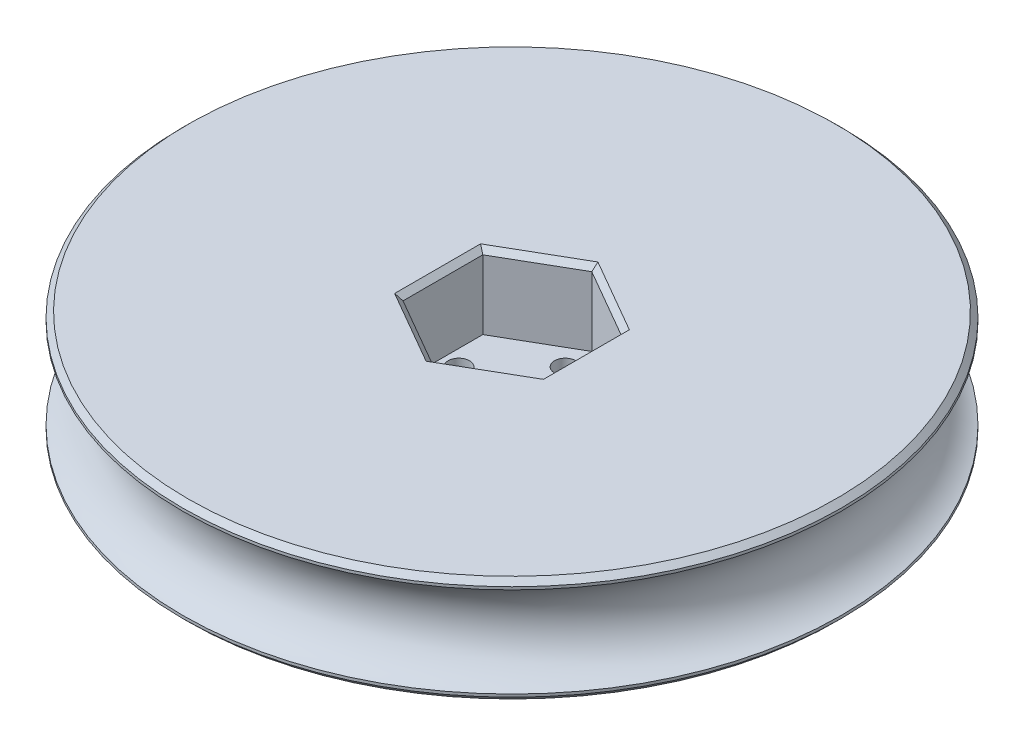
ISO-10303-21;
HEADER;
FILE_DESCRIPTION(('STEP AP214'),'2;1');
FILE_NAME('part.step','',(''),(''),'','','');
FILE_SCHEMA(('AUTOMOTIVE_DESIGN { 1 0 10303 214 1 1 1 1 }'));
ENDSEC;
DATA;
#1=APPLICATION_CONTEXT('core data for automotive mechanical design processes');
#2=APPLICATION_PROTOCOL_DEFINITION('international standard','automotive_design',2000,#1);
#3=PRODUCT_CONTEXT('',#1,'mechanical');
#4=PRODUCT('Part','Part','',(#3));
#5=PRODUCT_RELATED_PRODUCT_CATEGORY('part','',(#4));
#6=PRODUCT_DEFINITION_FORMATION('','',#4);
#7=PRODUCT_DEFINITION_CONTEXT('part definition',#1,'design');
#8=PRODUCT_DEFINITION('design','',#6,#7);
#9=PRODUCT_DEFINITION_SHAPE('','',#8);
#10=(LENGTH_UNIT() NAMED_UNIT(*) SI_UNIT(.MILLI.,.METRE.));
#11=(NAMED_UNIT(*) PLANE_ANGLE_UNIT() SI_UNIT($,.RADIAN.));
#12=(NAMED_UNIT(*) SI_UNIT($,.STERADIAN.) SOLID_ANGLE_UNIT());
#13=UNCERTAINTY_MEASURE_WITH_UNIT(LENGTH_MEASURE(1.E-05),#10,'distance_accuracy_value','');
#14=(GEOMETRIC_REPRESENTATION_CONTEXT(3) GLOBAL_UNCERTAINTY_ASSIGNED_CONTEXT((#13)) GLOBAL_UNIT_ASSIGNED_CONTEXT((#10,
#11,#12)) REPRESENTATION_CONTEXT('',''));
#15=CARTESIAN_POINT('',(0.,0.,0.));
#16=DIRECTION('',(0.,0.,1.));
#17=DIRECTION('',(1.,0.,0.));
#18=AXIS2_PLACEMENT_3D('',#15,#16,#17);
#19=CARTESIAN_POINT('',(0.,20.,0.));
#20=DIRECTION('',(0.,-1.,0.));
#21=DIRECTION('',(0.,0.,-1.));
#22=AXIS2_PLACEMENT_3D('',#19,#20,#21);
#23=CYLINDRICAL_SURFACE('',#22,62.);
#24=CARTESIAN_POINT('',(0.,1.00000000000001,0.));
#25=DIRECTION('',(0.,1.,0.));
#26=DIRECTION('',(0.,0.,1.));
#27=AXIS2_PLACEMENT_3D('',#24,#25,#26);
#28=CIRCLE('',#27,62.);
#29=CARTESIAN_POINT('',(0.,1.00000000000001,62.));
#30=VERTEX_POINT('',#29);
#31=EDGE_CURVE('E185',#30,#30,#28,.T.);
#32=ORIENTED_EDGE('',*,*,#31,.T.);
#33=EDGE_LOOP('',(#32));
#34=FACE_BOUND('',#33,.T.);
#35=CARTESIAN_POINT('',(0.,1.51471862576144,0.));
#36=DIRECTION('',(0.,1.,0.));
#37=DIRECTION('',(-1.,0.,0.));
#38=AXIS2_PLACEMENT_3D('',#35,#36,#37);
#39=CIRCLE('',#38,62.);
#40=CARTESIAN_POINT('',(-62.,1.51471862576143,0.));
#41=VERTEX_POINT('',#40);
#42=EDGE_CURVE('E181',#41,#41,#39,.T.);
#43=ORIENTED_EDGE('',*,*,#42,.F.);
#44=EDGE_LOOP('',(#43));
#45=FACE_BOUND('',#44,.T.);
#46=ADVANCED_FACE('F41',(#34,#45),#23,.T.);
#47=CARTESIAN_POINT('',(0.,0.,0.));
#48=DIRECTION('',(0.,1.,0.));
#49=DIRECTION('',(0.,0.,1.));
#50=AXIS2_PLACEMENT_3D('',#47,#48,#49);
#51=PLANE('',#50);
#52=CARTESIAN_POINT('',(-10.,0.,-1.07873342167326E-13));
#53=DIRECTION('',(0.,1.,0.));
#54=DIRECTION('',(0.,0.,1.));
#55=AXIS2_PLACEMENT_3D('',#52,#53,#54);
#56=CIRCLE('',#55,3.99999999999999);
#57=CARTESIAN_POINT('',(-10.,0.,3.99999999999988));
#58=VERTEX_POINT('',#57);
#59=EDGE_CURVE('E280',#58,#58,#56,.T.);
#60=ORIENTED_EDGE('',*,*,#59,.T.);
#61=EDGE_LOOP('',(#60));
#62=FACE_BOUND('',#61,.T.);
#63=CARTESIAN_POINT('',(0.,0.,-10.));
#64=DIRECTION('',(0.,1.,0.));
#65=DIRECTION('',(0.,0.,1.));
#66=AXIS2_PLACEMENT_3D('',#63,#64,#65);
#67=CIRCLE('',#66,4.00000000000003);
#68=CARTESIAN_POINT('',(0.,0.,-5.99999999999997));
#69=VERTEX_POINT('',#68);
#70=EDGE_CURVE('E276',#69,#69,#67,.T.);
#71=ORIENTED_EDGE('',*,*,#70,.T.);
#72=EDGE_LOOP('',(#71));
#73=FACE_BOUND('',#72,.T.);
#74=CARTESIAN_POINT('',(10.,0.,0.));
#75=DIRECTION('',(0.,1.,0.));
#76=DIRECTION('',(0.,0.,1.));
#77=AXIS2_PLACEMENT_3D('',#74,#75,#76);
#78=CIRCLE('',#77,4.00000000000003);
#79=CARTESIAN_POINT('',(10.,0.,4.00000000000007));
#80=VERTEX_POINT('',#79);
#81=EDGE_CURVE('E272',#80,#80,#78,.T.);
#82=ORIENTED_EDGE('',*,*,#81,.T.);
#83=EDGE_LOOP('',(#82));
#84=FACE_BOUND('',#83,.T.);
#85=CARTESIAN_POINT('',(5.6788915021267E-13,0.,10.));
#86=DIRECTION('',(0.,1.,0.));
#87=DIRECTION('',(0.,0.,1.));
#88=AXIS2_PLACEMENT_3D('',#85,#86,#87);
#89=CIRCLE('',#88,4.00000000000061);
#90=CARTESIAN_POINT('',(5.6788915021267E-13,0.,14.0000000000006));
#91=VERTEX_POINT('',#90);
#92=EDGE_CURVE('E247',#91,#91,#89,.T.);
#93=ORIENTED_EDGE('',*,*,#92,.T.);
#94=EDGE_LOOP('',(#93));
#95=FACE_BOUND('',#94,.T.);
#96=CARTESIAN_POINT('',(0.,0.,0.));
#97=DIRECTION('',(0.,1.,0.));
#98=DIRECTION('',(0.,0.,1.));
#99=AXIS2_PLACEMENT_3D('',#96,#97,#98);
#100=CIRCLE('',#99,61.);
#101=CARTESIAN_POINT('',(0.,0.,61.));
#102=VERTEX_POINT('',#101);
#103=EDGE_CURVE('E189',#102,#102,#100,.F.);
#104=ORIENTED_EDGE('',*,*,#103,.T.);
#105=EDGE_LOOP('',(#104));
#106=FACE_BOUND('',#105,.T.);
#107=ADVANCED_FACE('F304',(#62,#73,#84,#95,#106),#51,.F.);
#108=CARTESIAN_POINT('',(0.,10.,0.));
#109=DIRECTION('',(0.,-1.,0.));
#110=DIRECTION('',(1.,0.,0.));
#111=AXIS2_PLACEMENT_3D('',#108,#109,#110);
#112=TOROIDAL_SURFACE('',#111,65.,9.);
#113=CARTESIAN_POINT('',(0.,18.4852813742386,0.));
#114=DIRECTION('',(0.,-1.,0.));
#115=DIRECTION('',(1.,0.,0.));
#116=AXIS2_PLACEMENT_3D('',#113,#114,#115);
#117=CIRCLE('',#116,62.);
#118=CARTESIAN_POINT('',(62.,18.4852813742386,0.));
#119=VERTEX_POINT('',#118);
#120=EDGE_CURVE('E165',#119,#119,#117,.T.);
#121=ORIENTED_EDGE('',*,*,#120,.T.);
#122=EDGE_LOOP('',(#121));
#123=FACE_BOUND('',#122,.T.);
#124=ORIENTED_EDGE('',*,*,#42,.T.);
#125=EDGE_LOOP('',(#124));
#126=FACE_BOUND('',#125,.T.);
#127=ADVANCED_FACE('F307',(#123,#126),#112,.F.);
#128=CARTESIAN_POINT('',(0.,20.,0.));
#129=DIRECTION('',(0.,1.,0.));
#130=DIRECTION('',(0.,0.,1.));
#131=AXIS2_PLACEMENT_3D('',#128,#129,#130);
#132=PLANE('',#131);
#133=CARTESIAN_POINT('',(0.,20.,0.));
#134=DIRECTION('',(0.,1.,0.));
#135=DIRECTION('',(0.,0.,1.));
#136=AXIS2_PLACEMENT_3D('',#133,#134,#135);
#137=CIRCLE('',#136,60.9999999999999);
#138=CARTESIAN_POINT('',(0.,20.,60.9999999999999));
#139=VERTEX_POINT('',#138);
#140=EDGE_CURVE('E224',#139,#139,#137,.T.);
#141=ORIENTED_EDGE('',*,*,#140,.T.);
#142=EDGE_LOOP('',(#141));
#143=FACE_BOUND('',#142,.T.);
#144=DIRECTION('',(0.,0.,-1.));
#145=VECTOR('',#144,1.);
#146=CARTESIAN_POINT('',(-14.,20.,-7.50555349946513));
#147=LINE('',#146,#145);
#148=CARTESIAN_POINT('',(-14.,20.,8.08290376865476));
#149=VERTEX_POINT('',#148);
#150=CARTESIAN_POINT('',(-14.,20.,-8.08290376865475));
#151=VERTEX_POINT('',#150);
#152=EDGE_CURVE('E217',#149,#151,#147,.T.);
#153=ORIENTED_EDGE('',*,*,#152,.T.);
#154=DIRECTION('',(0.866025403784439,0.,-0.5));
#155=VECTOR('',#154,1.);
#156=CARTESIAN_POINT('',(-0.499999999999993,20.,-15.8771324027147));
#157=LINE('',#156,#155);
#158=CARTESIAN_POINT('',(0.,20.,-16.1658075373095));
#159=VERTEX_POINT('',#158);
#160=EDGE_CURVE('E220',#151,#159,#157,.T.);
#161=ORIENTED_EDGE('',*,*,#160,.T.);
#162=DIRECTION('',(0.866025403784439,0.,0.5));
#163=VECTOR('',#162,1.);
#164=CARTESIAN_POINT('',(13.5,20.,-8.37157890324957));
#165=LINE('',#164,#163);
#166=CARTESIAN_POINT('',(14.,20.,-8.08290376865476));
#167=VERTEX_POINT('',#166);
#168=EDGE_CURVE('E193',#159,#167,#165,.T.);
#169=ORIENTED_EDGE('',*,*,#168,.T.);
#170=DIRECTION('',(0.,0.,1.));
#171=VECTOR('',#170,1.);
#172=CARTESIAN_POINT('',(14.,20.,7.50555349946514));
#173=LINE('',#172,#171);
#174=CARTESIAN_POINT('',(14.,20.,8.08290376865476));
#175=VERTEX_POINT('',#174);
#176=EDGE_CURVE('E208',#167,#175,#173,.T.);
#177=ORIENTED_EDGE('',*,*,#176,.T.);
#178=DIRECTION('',(-0.866025403784439,0.,0.5));
#179=VECTOR('',#178,1.);
#180=CARTESIAN_POINT('',(0.499999999999995,20.,15.8771324027147));
#181=LINE('',#180,#179);
#182=CARTESIAN_POINT('',(0.,20.,16.1658075373095));
#183=VERTEX_POINT('',#182);
#184=EDGE_CURVE('E211',#175,#183,#181,.T.);
#185=ORIENTED_EDGE('',*,*,#184,.T.);
#186=DIRECTION('',(-0.866025403784439,0.,-0.5));
#187=VECTOR('',#186,1.);
#188=CARTESIAN_POINT('',(-13.5,20.,8.37157890324957));
#189=LINE('',#188,#187);
#190=EDGE_CURVE('E214',#183,#149,#189,.T.);
#191=ORIENTED_EDGE('',*,*,#190,.T.);
#192=EDGE_LOOP('',(#153,#161,#169,#177,#185,#191));
#193=FACE_BOUND('',#192,.T.);
#194=ADVANCED_FACE('F327',(#143,#193),#132,.T.);
#195=CARTESIAN_POINT('',(0.,18.9999999999999,0.));
#196=DIRECTION('',(0.,1.,0.));
#197=DIRECTION('',(0.,0.,1.));
#198=AXIS2_PLACEMENT_3D('',#195,#196,#197);
#199=CIRCLE('',#198,62.);
#200=CARTESIAN_POINT('',(0.,18.9999999999999,62.));
#201=VERTEX_POINT('',#200);
#202=EDGE_CURVE('E228',#201,#201,#199,.F.);
#203=ORIENTED_EDGE('',*,*,#202,.T.);
#204=EDGE_LOOP('',(#203));
#205=FACE_BOUND('',#204,.T.);
#206=ORIENTED_EDGE('',*,*,#120,.F.);
#207=EDGE_LOOP('',(#206));
#208=FACE_BOUND('',#207,.T.);
#209=ADVANCED_FACE('F317',(#205,#208),#23,.T.);
#210=CARTESIAN_POINT('',(0.,1.00000000000001,0.));
#211=DIRECTION('',(0.,1.,0.));
#212=DIRECTION('',(0.,0.,1.));
#213=AXIS2_PLACEMENT_3D('',#210,#211,#212);
#214=CONICAL_SURFACE('',#213,62.,0.785398163397452);
#215=ORIENTED_EDGE('',*,*,#103,.F.);
#216=EDGE_LOOP('',(#215));
#217=FACE_BOUND('',#216,.T.);
#218=ORIENTED_EDGE('',*,*,#31,.F.);
#219=EDGE_LOOP('',(#218));
#220=FACE_BOUND('',#219,.T.);
#221=ADVANCED_FACE('F314',(#217,#220),#214,.T.);
#222=CARTESIAN_POINT('',(13.,6.,-7.50555349946514));
#223=DIRECTION('',(0.5,0.,-0.866025403784439));
#224=DIRECTION('',(-0.866025403784439,0.,-0.5));
#225=AXIS2_PLACEMENT_3D('',#222,#223,#224);
#226=PLANE('',#225);
#227=DIRECTION('',(0.,1.,0.));
#228=VECTOR('',#227,1.);
#229=CARTESIAN_POINT('',(13.,6.,-7.50555349946514));
#230=LINE('',#229,#228);
#231=CARTESIAN_POINT('',(13.,6.,-7.50555349946514));
#232=VERTEX_POINT('',#231);
#233=CARTESIAN_POINT('',(13.,19.,-7.50555349946514));
#234=VERTEX_POINT('',#233);
#235=EDGE_CURVE('E162',#232,#234,#230,.T.);
#236=ORIENTED_EDGE('',*,*,#235,.T.);
#237=DIRECTION('',(-0.866025403784439,0.,-0.5));
#238=VECTOR('',#237,1.);
#239=CARTESIAN_POINT('',(0.,19.,-15.0111069989303));
#240=LINE('',#239,#238);
#241=CARTESIAN_POINT('',(0.,19.,-15.0111069989303));
#242=VERTEX_POINT('',#241);
#243=EDGE_CURVE('E122',#234,#242,#240,.T.);
#244=ORIENTED_EDGE('',*,*,#243,.T.);
#245=DIRECTION('',(0.,1.,0.));
#246=VECTOR('',#245,1.);
#247=CARTESIAN_POINT('',(0.,6.,-15.0111069989303));
#248=LINE('',#247,#246);
#249=CARTESIAN_POINT('',(0.,6.,-15.0111069989303));
#250=VERTEX_POINT('',#249);
#251=EDGE_CURVE('E115',#250,#242,#248,.T.);
#252=ORIENTED_EDGE('',*,*,#251,.F.);
#253=DIRECTION('',(-0.866025403784439,0.,-0.5));
#254=VECTOR('',#253,1.);
#255=CARTESIAN_POINT('',(13.,6.,-7.50555349946514));
#256=LINE('',#255,#254);
#257=EDGE_CURVE('E119',#232,#250,#256,.T.);
#258=ORIENTED_EDGE('',*,*,#257,.F.);
#259=EDGE_LOOP('',(#236,#244,#252,#258));
#260=FACE_BOUND('',#259,.T.);
#261=ADVANCED_FACE('F117',(#260),#226,.F.);
#262=CARTESIAN_POINT('',(13.,6.,7.50555349946514));
#263=DIRECTION('',(1.,0.,0.));
#264=DIRECTION('',(0.,0.,-1.));
#265=AXIS2_PLACEMENT_3D('',#262,#263,#264);
#266=PLANE('',#265);
#267=DIRECTION('',(0.,1.,0.));
#268=VECTOR('',#267,1.);
#269=CARTESIAN_POINT('',(13.,6.,7.50555349946514));
#270=LINE('',#269,#268);
#271=CARTESIAN_POINT('',(13.,6.,7.50555349946514));
#272=VERTEX_POINT('',#271);
#273=CARTESIAN_POINT('',(13.,19.,7.50555349946514));
#274=VERTEX_POINT('',#273);
#275=EDGE_CURVE('E166',#272,#274,#270,.T.);
#276=ORIENTED_EDGE('',*,*,#275,.T.);
#277=DIRECTION('',(0.,0.,-1.));
#278=VECTOR('',#277,1.);
#279=CARTESIAN_POINT('',(13.,19.,-7.50555349946514));
#280=LINE('',#279,#278);
#281=EDGE_CURVE('E58',#274,#234,#280,.T.);
#282=ORIENTED_EDGE('',*,*,#281,.T.);
#283=ORIENTED_EDGE('',*,*,#235,.F.);
#284=DIRECTION('',(0.,0.,-1.));
#285=VECTOR('',#284,1.);
#286=CARTESIAN_POINT('',(13.,6.,7.50555349946514));
#287=LINE('',#286,#285);
#288=EDGE_CURVE('E128',#272,#232,#287,.T.);
#289=ORIENTED_EDGE('',*,*,#288,.F.);
#290=EDGE_LOOP('',(#276,#282,#283,#289));
#291=FACE_BOUND('',#290,.T.);
#292=ADVANCED_FACE('F441',(#291),#266,.F.);
#293=CARTESIAN_POINT('',(0.,6.,15.0111069989303));
#294=DIRECTION('',(0.5,0.,0.866025403784439));
#295=DIRECTION('',(0.866025403784439,0.,-0.5));
#296=AXIS2_PLACEMENT_3D('',#293,#294,#295);
#297=PLANE('',#296);
#298=DIRECTION('',(0.,1.,0.));
#299=VECTOR('',#298,1.);
#300=CARTESIAN_POINT('',(0.,6.,15.0111069989303));
#301=LINE('',#300,#299);
#302=CARTESIAN_POINT('',(0.,6.,15.0111069989303));
#303=VERTEX_POINT('',#302);
#304=CARTESIAN_POINT('',(0.,19.,15.0111069989303));
#305=VERTEX_POINT('',#304);
#306=EDGE_CURVE('E169',#303,#305,#301,.T.);
#307=ORIENTED_EDGE('',*,*,#306,.T.);
#308=DIRECTION('',(0.866025403784439,0.,-0.5));
#309=VECTOR('',#308,1.);
#310=CARTESIAN_POINT('',(13.,19.,7.50555349946513));
#311=LINE('',#310,#309);
#312=EDGE_CURVE('E66',#305,#274,#311,.T.);
#313=ORIENTED_EDGE('',*,*,#312,.T.);
#314=ORIENTED_EDGE('',*,*,#275,.F.);
#315=DIRECTION('',(0.866025403784439,0.,-0.5));
#316=VECTOR('',#315,1.);
#317=CARTESIAN_POINT('',(0.,6.,15.0111069989303));
#318=LINE('',#317,#316);
#319=EDGE_CURVE('E157',#303,#272,#318,.T.);
#320=ORIENTED_EDGE('',*,*,#319,.F.);
#321=EDGE_LOOP('',(#307,#313,#314,#320));
#322=FACE_BOUND('',#321,.T.);
#323=ADVANCED_FACE('F444',(#322),#297,.F.);
#324=CARTESIAN_POINT('',(-13.,6.,7.50555349946514));
#325=DIRECTION('',(-0.5,0.,0.866025403784439));
#326=DIRECTION('',(0.866025403784439,0.,0.5));
#327=AXIS2_PLACEMENT_3D('',#324,#325,#326);
#328=PLANE('',#327);
#329=DIRECTION('',(0.,1.,0.));
#330=VECTOR('',#329,1.);
#331=CARTESIAN_POINT('',(-13.,6.,7.50555349946514));
#332=LINE('',#331,#330);
#333=CARTESIAN_POINT('',(-13.,6.,7.50555349946514));
#334=VERTEX_POINT('',#333);
#335=CARTESIAN_POINT('',(-13.,19.,7.50555349946514));
#336=VERTEX_POINT('',#335);
#337=EDGE_CURVE('E172',#334,#336,#332,.T.);
#338=ORIENTED_EDGE('',*,*,#337,.T.);
#339=DIRECTION('',(0.866025403784439,0.,0.5));
#340=VECTOR('',#339,1.);
#341=CARTESIAN_POINT('',(0.,19.,15.0111069989303));
#342=LINE('',#341,#340);
#343=EDGE_CURVE('E238',#336,#305,#342,.T.);
#344=ORIENTED_EDGE('',*,*,#343,.T.);
#345=ORIENTED_EDGE('',*,*,#306,.F.);
#346=DIRECTION('',(0.866025403784439,0.,0.5));
#347=VECTOR('',#346,1.);
#348=CARTESIAN_POINT('',(-13.,6.,7.50555349946514));
#349=LINE('',#348,#347);
#350=EDGE_CURVE('E153',#334,#303,#349,.T.);
#351=ORIENTED_EDGE('',*,*,#350,.F.);
#352=EDGE_LOOP('',(#338,#344,#345,#351));
#353=FACE_BOUND('',#352,.T.);
#354=ADVANCED_FACE('F447',(#353),#328,.F.);
#355=CARTESIAN_POINT('',(-13.,6.,-7.50555349946513));
#356=DIRECTION('',(-1.,0.,0.));
#357=DIRECTION('',(0.,0.,1.));
#358=AXIS2_PLACEMENT_3D('',#355,#356,#357);
#359=PLANE('',#358);
#360=DIRECTION('',(0.,1.,0.));
#361=VECTOR('',#360,1.);
#362=CARTESIAN_POINT('',(-13.,6.,-7.50555349946513));
#363=LINE('',#362,#361);
#364=CARTESIAN_POINT('',(-13.,6.,-7.50555349946513));
#365=VERTEX_POINT('',#364);
#366=CARTESIAN_POINT('',(-13.,19.,-7.50555349946513));
#367=VERTEX_POINT('',#366);
#368=EDGE_CURVE('E127',#365,#367,#363,.T.);
#369=ORIENTED_EDGE('',*,*,#368,.T.);
#370=DIRECTION('',(0.,0.,1.));
#371=VECTOR('',#370,1.);
#372=CARTESIAN_POINT('',(-13.,19.,7.50555349946514));
#373=LINE('',#372,#371);
#374=EDGE_CURVE('E235',#367,#336,#373,.T.);
#375=ORIENTED_EDGE('',*,*,#374,.T.);
#376=ORIENTED_EDGE('',*,*,#337,.F.);
#377=DIRECTION('',(0.,0.,1.));
#378=VECTOR('',#377,1.);
#379=CARTESIAN_POINT('',(-13.,6.,-7.50555349946513));
#380=LINE('',#379,#378);
#381=EDGE_CURVE('E138',#365,#334,#380,.T.);
#382=ORIENTED_EDGE('',*,*,#381,.F.);
#383=EDGE_LOOP('',(#369,#375,#376,#382));
#384=FACE_BOUND('',#383,.T.);
#385=ADVANCED_FACE('F450',(#384),#359,.F.);
#386=CARTESIAN_POINT('',(0.,6.,-15.0111069989303));
#387=DIRECTION('',(-0.5,0.,-0.866025403784439));
#388=DIRECTION('',(-0.866025403784439,0.,0.5));
#389=AXIS2_PLACEMENT_3D('',#386,#387,#388);
#390=PLANE('',#389);
#391=ORIENTED_EDGE('',*,*,#251,.T.);
#392=DIRECTION('',(-0.866025403784439,0.,0.5));
#393=VECTOR('',#392,1.);
#394=CARTESIAN_POINT('',(-13.,19.,-7.50555349946513));
#395=LINE('',#394,#393);
#396=EDGE_CURVE('E232',#242,#367,#395,.T.);
#397=ORIENTED_EDGE('',*,*,#396,.T.);
#398=ORIENTED_EDGE('',*,*,#368,.F.);
#399=DIRECTION('',(-0.866025403784439,0.,0.5));
#400=VECTOR('',#399,1.);
#401=CARTESIAN_POINT('',(0.,6.,-15.0111069989303));
#402=LINE('',#401,#400);
#403=EDGE_CURVE('E131',#250,#365,#402,.T.);
#404=ORIENTED_EDGE('',*,*,#403,.F.);
#405=EDGE_LOOP('',(#391,#397,#398,#404));
#406=FACE_BOUND('',#405,.T.);
#407=ADVANCED_FACE('F132',(#406),#390,.F.);
#408=CARTESIAN_POINT('',(0.,6.,0.));
#409=DIRECTION('',(0.,1.,0.));
#410=DIRECTION('',(0.,0.,1.));
#411=AXIS2_PLACEMENT_3D('',#408,#409,#410);
#412=PLANE('',#411);
#413=CARTESIAN_POINT('',(0.,6.,-10.));
#414=DIRECTION('',(0.,1.,0.));
#415=DIRECTION('',(0.,0.,1.));
#416=AXIS2_PLACEMENT_3D('',#413,#414,#415);
#417=CIRCLE('',#416,2.);
#418=CARTESIAN_POINT('',(0.,6.,-8.));
#419=VERTEX_POINT('',#418);
#420=EDGE_CURVE('E144',#419,#419,#417,.T.);
#421=ORIENTED_EDGE('',*,*,#420,.F.);
#422=EDGE_LOOP('',(#421));
#423=FACE_BOUND('',#422,.T.);
#424=CARTESIAN_POINT('',(10.,6.,0.));
#425=DIRECTION('',(0.,1.,0.));
#426=DIRECTION('',(0.,0.,1.));
#427=AXIS2_PLACEMENT_3D('',#424,#425,#426);
#428=CIRCLE('',#427,2.);
#429=CARTESIAN_POINT('',(10.,6.,2.00000000000004));
#430=VERTEX_POINT('',#429);
#431=EDGE_CURVE('E148',#430,#430,#428,.T.);
#432=ORIENTED_EDGE('',*,*,#431,.F.);
#433=EDGE_LOOP('',(#432));
#434=FACE_BOUND('',#433,.T.);
#435=CARTESIAN_POINT('',(5.6788915021267E-13,6.,10.));
#436=DIRECTION('',(0.,1.,0.));
#437=DIRECTION('',(0.,0.,1.));
#438=AXIS2_PLACEMENT_3D('',#435,#436,#437);
#439=CIRCLE('',#438,2.00000000000061);
#440=CARTESIAN_POINT('',(5.6788915021267E-13,6.,12.0000000000006));
#441=VERTEX_POINT('',#440);
#442=EDGE_CURVE('E198',#441,#441,#439,.T.);
#443=ORIENTED_EDGE('',*,*,#442,.F.);
#444=EDGE_LOOP('',(#443));
#445=FACE_BOUND('',#444,.T.);
#446=CARTESIAN_POINT('',(-10.,6.,-1.07873342167326E-13));
#447=DIRECTION('',(0.,1.,0.));
#448=DIRECTION('',(0.,0.,1.));
#449=AXIS2_PLACEMENT_3D('',#446,#447,#448);
#450=CIRCLE('',#449,2.);
#451=CARTESIAN_POINT('',(-10.,6.,1.99999999999989));
#452=VERTEX_POINT('',#451);
#453=EDGE_CURVE('E194',#452,#452,#450,.T.);
#454=ORIENTED_EDGE('',*,*,#453,.F.);
#455=EDGE_LOOP('',(#454));
#456=FACE_BOUND('',#455,.T.);
#457=ORIENTED_EDGE('',*,*,#257,.T.);
#458=ORIENTED_EDGE('',*,*,#403,.T.);
#459=ORIENTED_EDGE('',*,*,#381,.T.);
#460=ORIENTED_EDGE('',*,*,#350,.T.);
#461=ORIENTED_EDGE('',*,*,#319,.T.);
#462=ORIENTED_EDGE('',*,*,#288,.T.);
#463=EDGE_LOOP('',(#457,#458,#459,#460,#461,#462));
#464=FACE_BOUND('',#463,.T.);
#465=ADVANCED_FACE('F140',(#423,#434,#445,#456,#464),#412,.T.);
#466=CARTESIAN_POINT('',(-10.,0.,-1.07873342167326E-13));
#467=DIRECTION('',(0.,1.,0.));
#468=DIRECTION('',(0.,0.,1.));
#469=AXIS2_PLACEMENT_3D('',#466,#467,#468);
#470=CYLINDRICAL_SURFACE('',#469,2.);
#471=CARTESIAN_POINT('',(-10.,1.99999999999998,-1.07873342167326E-13));
#472=DIRECTION('',(0.,1.,0.));
#473=DIRECTION('',(0.,0.,1.));
#474=AXIS2_PLACEMENT_3D('',#471,#472,#473);
#475=CIRCLE('',#474,2.);
#476=CARTESIAN_POINT('',(-10.,1.99999999999998,1.99999999999989));
#477=VERTEX_POINT('',#476);
#478=EDGE_CURVE('E284',#477,#477,#475,.F.);
#479=ORIENTED_EDGE('',*,*,#478,.T.);
#480=EDGE_LOOP('',(#479));
#481=FACE_BOUND('',#480,.T.);
#482=ORIENTED_EDGE('',*,*,#453,.T.);
#483=EDGE_LOOP('',(#482));
#484=FACE_BOUND('',#483,.T.);
#485=ADVANCED_FACE('F422',(#481,#484),#470,.F.);
#486=CARTESIAN_POINT('',(5.6788915021267E-13,0.,10.));
#487=DIRECTION('',(0.,1.,0.));
#488=DIRECTION('',(0.,0.,1.));
#489=AXIS2_PLACEMENT_3D('',#486,#487,#488);
#490=CYLINDRICAL_SURFACE('',#489,2.00000000000061);
#491=CARTESIAN_POINT('',(5.6788915021267E-13,1.99999999999999,10.));
#492=DIRECTION('',(0.,1.,0.));
#493=DIRECTION('',(0.,0.,1.));
#494=AXIS2_PLACEMENT_3D('',#491,#492,#493);
#495=CIRCLE('',#494,2.00000000000061);
#496=CARTESIAN_POINT('',(5.6788915021267E-13,1.99999999999999,12.0000000000006));
#497=VERTEX_POINT('',#496);
#498=EDGE_CURVE('E11',#497,#497,#495,.F.);
#499=ORIENTED_EDGE('',*,*,#498,.T.);
#500=EDGE_LOOP('',(#499));
#501=FACE_BOUND('',#500,.T.);
#502=ORIENTED_EDGE('',*,*,#442,.T.);
#503=EDGE_LOOP('',(#502));
#504=FACE_BOUND('',#503,.T.);
#505=ADVANCED_FACE('F431',(#501,#504),#490,.F.);
#506=CARTESIAN_POINT('',(10.,0.,0.));
#507=DIRECTION('',(0.,1.,0.));
#508=DIRECTION('',(0.,0.,1.));
#509=AXIS2_PLACEMENT_3D('',#506,#507,#508);
#510=CYLINDRICAL_SURFACE('',#509,2.);
#511=CARTESIAN_POINT('',(10.,2.00000000000001,0.));
#512=DIRECTION('',(0.,1.,0.));
#513=DIRECTION('',(0.,0.,1.));
#514=AXIS2_PLACEMENT_3D('',#511,#512,#513);
#515=CIRCLE('',#514,2.);
#516=CARTESIAN_POINT('',(10.,2.00000000000001,2.00000000000004));
#517=VERTEX_POINT('',#516);
#518=EDGE_CURVE('E51',#517,#517,#515,.F.);
#519=ORIENTED_EDGE('',*,*,#518,.T.);
#520=EDGE_LOOP('',(#519));
#521=FACE_BOUND('',#520,.T.);
#522=ORIENTED_EDGE('',*,*,#431,.T.);
#523=EDGE_LOOP('',(#522));
#524=FACE_BOUND('',#523,.T.);
#525=ADVANCED_FACE('F295',(#521,#524),#510,.F.);
#526=CARTESIAN_POINT('',(0.,0.,-10.));
#527=DIRECTION('',(0.,1.,0.));
#528=DIRECTION('',(0.,0.,1.));
#529=AXIS2_PLACEMENT_3D('',#526,#527,#528);
#530=CYLINDRICAL_SURFACE('',#529,2.);
#531=CARTESIAN_POINT('',(0.,2.00000000000001,-10.));
#532=DIRECTION('',(0.,1.,0.));
#533=DIRECTION('',(0.,0.,1.));
#534=AXIS2_PLACEMENT_3D('',#531,#532,#533);
#535=CIRCLE('',#534,2.);
#536=CARTESIAN_POINT('',(0.,2.00000000000001,-8.));
#537=VERTEX_POINT('',#536);
#538=EDGE_CURVE('E288',#537,#537,#535,.F.);
#539=ORIENTED_EDGE('',*,*,#538,.T.);
#540=EDGE_LOOP('',(#539));
#541=FACE_BOUND('',#540,.T.);
#542=ORIENTED_EDGE('',*,*,#420,.T.);
#543=EDGE_LOOP('',(#542));
#544=FACE_BOUND('',#543,.T.);
#545=ADVANCED_FACE('F349',(#541,#544),#530,.F.);
#546=CARTESIAN_POINT('',(0.,20.,0.));
#547=DIRECTION('',(0.,-1.,0.));
#548=DIRECTION('',(0.,0.,-1.));
#549=AXIS2_PLACEMENT_3D('',#546,#547,#548);
#550=CONICAL_SURFACE('',#549,60.9999999999999,0.785398163397448);
#551=ORIENTED_EDGE('',*,*,#202,.F.);
#552=EDGE_LOOP('',(#551));
#553=FACE_BOUND('',#552,.T.);
#554=ORIENTED_EDGE('',*,*,#140,.F.);
#555=EDGE_LOOP('',(#554));
#556=FACE_BOUND('',#555,.T.);
#557=ADVANCED_FACE('F342',(#553,#556),#550,.T.);
#558=CARTESIAN_POINT('',(0.,19.,15.0111069989303));
#559=DIRECTION('',(-0.353553390593273,0.707106781186549,-0.612372435695793));
#560=DIRECTION('',(-0.866025403784439,0.,0.5));
#561=AXIS2_PLACEMENT_3D('',#558,#559,#560);
#562=PLANE('',#561);
#563=DIRECTION('',(0.,0.654653670707976,0.755928946018455));
#564=VECTOR('',#563,1.);
#565=CARTESIAN_POINT('',(0.,15.2857142857143,10.7222192849502));
#566=LINE('',#565,#564);
#567=EDGE_CURVE('E262',#183,#305,#566,.F.);
#568=ORIENTED_EDGE('',*,*,#567,.F.);
#569=ORIENTED_EDGE('',*,*,#184,.F.);
#570=DIRECTION('',(0.654653670707977,0.654653670707976,0.377964473009229));
#571=VECTOR('',#570,1.);
#572=CARTESIAN_POINT('',(9.28571428571429,15.2857142857143,5.36110964247509));
#573=LINE('',#572,#571);
#574=EDGE_CURVE('E199',#274,#175,#573,.T.);
#575=ORIENTED_EDGE('',*,*,#574,.F.);
#576=ORIENTED_EDGE('',*,*,#312,.F.);
#577=EDGE_LOOP('',(#568,#569,#575,#576));
#578=FACE_BOUND('',#577,.T.);
#579=ADVANCED_FACE('F348',(#578),#562,.T.);
#580=CARTESIAN_POINT('',(13.,19.,7.50555349946514));
#581=DIRECTION('',(-0.707106781186547,0.707106781186548,0.));
#582=DIRECTION('',(0.,0.,1.));
#583=AXIS2_PLACEMENT_3D('',#580,#581,#582);
#584=PLANE('',#583);
#585=ORIENTED_EDGE('',*,*,#574,.T.);
#586=ORIENTED_EDGE('',*,*,#176,.F.);
#587=DIRECTION('',(0.654653670707977,0.654653670707976,-0.377964473009228));
#588=VECTOR('',#587,1.);
#589=CARTESIAN_POINT('',(9.28571428571427,15.2857142857143,-5.3611096424751));
#590=LINE('',#589,#588);
#591=EDGE_CURVE('E258',#234,#167,#590,.T.);
#592=ORIENTED_EDGE('',*,*,#591,.F.);
#593=ORIENTED_EDGE('',*,*,#281,.F.);
#594=EDGE_LOOP('',(#585,#586,#592,#593));
#595=FACE_BOUND('',#594,.T.);
#596=ADVANCED_FACE('F381',(#595),#584,.T.);
#597=CARTESIAN_POINT('',(-13.,19.,7.50555349946514));
#598=DIRECTION('',(0.353553390593274,0.707106781186547,-0.612372435695795));
#599=DIRECTION('',(-0.866025403784439,0.,-0.5));
#600=AXIS2_PLACEMENT_3D('',#597,#598,#599);
#601=PLANE('',#600);
#602=ORIENTED_EDGE('',*,*,#567,.T.);
#603=ORIENTED_EDGE('',*,*,#343,.F.);
#604=DIRECTION('',(-0.654653670707978,0.654653670707977,0.377964473009226));
#605=VECTOR('',#604,1.);
#606=CARTESIAN_POINT('',(-9.28571428571429,15.2857142857143,5.36110964247511));
#607=LINE('',#606,#605);
#608=EDGE_CURVE('E254',#149,#336,#607,.F.);
#609=ORIENTED_EDGE('',*,*,#608,.F.);
#610=ORIENTED_EDGE('',*,*,#190,.F.);
#611=EDGE_LOOP('',(#602,#603,#609,#610));
#612=FACE_BOUND('',#611,.T.);
#613=ADVANCED_FACE('F374',(#612),#601,.T.);
#614=CARTESIAN_POINT('',(13.,19.,-7.50555349946514));
#615=DIRECTION('',(-0.353553390593273,0.707106781186548,0.612372435695794));
#616=DIRECTION('',(0.866025403784439,0.,0.5));
#617=AXIS2_PLACEMENT_3D('',#614,#615,#616);
#618=PLANE('',#617);
#619=ORIENTED_EDGE('',*,*,#591,.T.);
#620=ORIENTED_EDGE('',*,*,#168,.F.);
#621=DIRECTION('',(0.,-0.654653670707977,0.755928946018455));
#622=VECTOR('',#621,1.);
#623=CARTESIAN_POINT('',(0.,19.,-15.0111069989303));
#624=LINE('',#623,#622);
#625=EDGE_CURVE('E251',#242,#159,#624,.F.);
#626=ORIENTED_EDGE('',*,*,#625,.F.);
#627=ORIENTED_EDGE('',*,*,#243,.F.);
#628=EDGE_LOOP('',(#619,#620,#626,#627));
#629=FACE_BOUND('',#628,.T.);
#630=ADVANCED_FACE('F367',(#629),#618,.T.);
#631=CARTESIAN_POINT('',(-13.,19.,-7.50555349946513));
#632=DIRECTION('',(0.707106781186547,0.707106781186548,0.));
#633=DIRECTION('',(0.,0.,-1.));
#634=AXIS2_PLACEMENT_3D('',#631,#632,#633);
#635=PLANE('',#634);
#636=ORIENTED_EDGE('',*,*,#608,.T.);
#637=ORIENTED_EDGE('',*,*,#374,.F.);
#638=DIRECTION('',(-0.654653670707978,0.654653670707977,-0.377964473009226));
#639=VECTOR('',#638,1.);
#640=CARTESIAN_POINT('',(-9.28571428571427,15.2857142857143,-5.36110964247509));
#641=LINE('',#640,#639);
#642=EDGE_CURVE('E248',#151,#367,#641,.F.);
#643=ORIENTED_EDGE('',*,*,#642,.F.);
#644=ORIENTED_EDGE('',*,*,#152,.F.);
#645=EDGE_LOOP('',(#636,#637,#643,#644));
#646=FACE_BOUND('',#645,.T.);
#647=ADVANCED_FACE('F360',(#646),#635,.T.);
#648=CARTESIAN_POINT('',(0.,19.,-15.0111069989303));
#649=DIRECTION('',(0.353553390593274,0.707106781186547,0.612372435695795));
#650=DIRECTION('',(0.866025403784439,0.,-0.5));
#651=AXIS2_PLACEMENT_3D('',#648,#649,#650);
#652=PLANE('',#651);
#653=ORIENTED_EDGE('',*,*,#625,.T.);
#654=ORIENTED_EDGE('',*,*,#160,.F.);
#655=ORIENTED_EDGE('',*,*,#642,.T.);
#656=ORIENTED_EDGE('',*,*,#396,.F.);
#657=EDGE_LOOP('',(#653,#654,#655,#656));
#658=FACE_BOUND('',#657,.T.);
#659=ADVANCED_FACE('F352',(#658),#652,.T.);
#660=CARTESIAN_POINT('',(-10.,0.,-1.07873342167326E-13));
#661=DIRECTION('',(0.,-1.,0.));
#662=DIRECTION('',(0.,0.,-1.));
#663=AXIS2_PLACEMENT_3D('',#660,#661,#662);
#664=CONICAL_SURFACE('',#663,3.99999999999999,0.78539816339745);
#665=ORIENTED_EDGE('',*,*,#478,.F.);
#666=EDGE_LOOP('',(#665));
#667=FACE_BOUND('',#666,.T.);
#668=ORIENTED_EDGE('',*,*,#59,.F.);
#669=EDGE_LOOP('',(#668));
#670=FACE_BOUND('',#669,.T.);
#671=ADVANCED_FACE('F359',(#667,#670),#664,.F.);
#672=CARTESIAN_POINT('',(0.,0.,-10.));
#673=DIRECTION('',(0.,-1.,0.));
#674=DIRECTION('',(0.,0.,-1.));
#675=AXIS2_PLACEMENT_3D('',#672,#673,#674);
#676=CONICAL_SURFACE('',#675,4.00000000000003,0.785398163397453);
#677=ORIENTED_EDGE('',*,*,#538,.F.);
#678=EDGE_LOOP('',(#677));
#679=FACE_BOUND('',#678,.T.);
#680=ORIENTED_EDGE('',*,*,#70,.F.);
#681=EDGE_LOOP('',(#680));
#682=FACE_BOUND('',#681,.T.);
#683=ADVANCED_FACE('F301',(#679,#682),#676,.F.);
#684=CARTESIAN_POINT('',(10.,0.,0.));
#685=DIRECTION('',(0.,-1.,0.));
#686=DIRECTION('',(0.,0.,-1.));
#687=AXIS2_PLACEMENT_3D('',#684,#685,#686);
#688=CONICAL_SURFACE('',#687,4.00000000000003,0.785398163397453);
#689=ORIENTED_EDGE('',*,*,#518,.F.);
#690=EDGE_LOOP('',(#689));
#691=FACE_BOUND('',#690,.T.);
#692=ORIENTED_EDGE('',*,*,#81,.F.);
#693=EDGE_LOOP('',(#692));
#694=FACE_BOUND('',#693,.T.);
#695=ADVANCED_FACE('F298',(#691,#694),#688,.F.);
#696=CARTESIAN_POINT('',(5.6788915021267E-13,0.,10.));
#697=DIRECTION('',(0.,-1.,0.));
#698=DIRECTION('',(0.,0.,-1.));
#699=AXIS2_PLACEMENT_3D('',#696,#697,#698);
#700=CONICAL_SURFACE('',#699,4.00000000000061,0.78539816339745);
#701=ORIENTED_EDGE('',*,*,#498,.F.);
#702=EDGE_LOOP('',(#701));
#703=FACE_BOUND('',#702,.T.);
#704=ORIENTED_EDGE('',*,*,#92,.F.);
#705=EDGE_LOOP('',(#704));
#706=FACE_BOUND('',#705,.T.);
#707=ADVANCED_FACE('F44',(#703,#706),#700,.F.);
#708=CLOSED_SHELL('',(#46,#107,#127,#194,#209,#221,#261,#292,#323,#354,#385,#407,#465,#485,#505,
#525,#545,#557,#579,#596,#613,#630,#647,#659,#671,#683,#695,#707));
#709=MANIFOLD_SOLID_BREP('B2',#708);
#710=ADVANCED_BREP_SHAPE_REPRESENTATION('',(#18,#709),#14);
#711=SHAPE_DEFINITION_REPRESENTATION(#9,#710);
ENDSEC;
END-ISO-10303-21;
